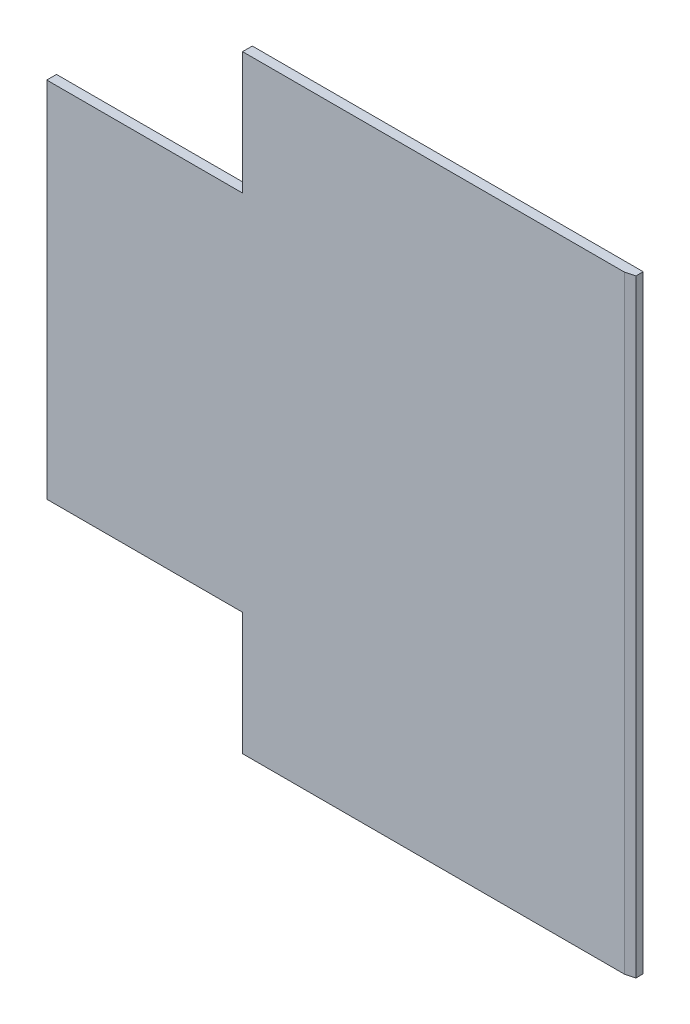
ISO-10303-21;
HEADER;
FILE_DESCRIPTION(('STEP AP214'),'2;1');
FILE_NAME('part.step','',(''),(''),'','','');
FILE_SCHEMA(('AUTOMOTIVE_DESIGN { 1 0 10303 214 1 1 1 1 }'));
ENDSEC;
DATA;
#1=APPLICATION_CONTEXT('core data for automotive mechanical design processes');
#2=APPLICATION_PROTOCOL_DEFINITION('international standard','automotive_design',2000,#1);
#3=PRODUCT_CONTEXT('',#1,'mechanical');
#4=PRODUCT('Part','Part','',(#3));
#5=PRODUCT_RELATED_PRODUCT_CATEGORY('part','',(#4));
#6=PRODUCT_DEFINITION_FORMATION('','',#4);
#7=PRODUCT_DEFINITION_CONTEXT('part definition',#1,'design');
#8=PRODUCT_DEFINITION('design','',#6,#7);
#9=PRODUCT_DEFINITION_SHAPE('','',#8);
#10=(LENGTH_UNIT() NAMED_UNIT(*) SI_UNIT(.MILLI.,.METRE.));
#11=(NAMED_UNIT(*) PLANE_ANGLE_UNIT() SI_UNIT($,.RADIAN.));
#12=(NAMED_UNIT(*) SI_UNIT($,.STERADIAN.) SOLID_ANGLE_UNIT());
#13=UNCERTAINTY_MEASURE_WITH_UNIT(LENGTH_MEASURE(1.E-05),#10,'distance_accuracy_value','');
#14=(GEOMETRIC_REPRESENTATION_CONTEXT(3) GLOBAL_UNCERTAINTY_ASSIGNED_CONTEXT((#13)) GLOBAL_UNIT_ASSIGNED_CONTEXT((#10,
#11,#12)) REPRESENTATION_CONTEXT('',''));
#15=CARTESIAN_POINT('',(0.,0.,0.));
#16=DIRECTION('',(0.,0.,1.));
#17=DIRECTION('',(1.,0.,0.));
#18=AXIS2_PLACEMENT_3D('',#15,#16,#17);
#19=CARTESIAN_POINT('',(0.,198.,0.));
#20=DIRECTION('',(0.,0.,-1.));
#21=DIRECTION('',(-1.,0.,0.));
#22=AXIS2_PLACEMENT_3D('',#19,#20,#21);
#23=PLANE('',#22);
#24=DIRECTION('',(0.,1.,0.));
#25=VECTOR('',#24,1.);
#26=CARTESIAN_POINT('',(124.301364543553,-2.,0.));
#27=LINE('',#26,#25);
#28=CARTESIAN_POINT('',(124.301364543553,0.,0.));
#29=VERTEX_POINT('',#28);
#30=CARTESIAN_POINT('',(124.301364543553,198.,0.));
#31=VERTEX_POINT('',#30);
#32=EDGE_CURVE('E108',#29,#31,#27,.T.);
#33=ORIENTED_EDGE('',*,*,#32,.T.);
#34=DIRECTION('',(1.,0.,0.));
#35=VECTOR('',#34,1.);
#36=CARTESIAN_POINT('',(0.,198.,0.));
#37=LINE('',#36,#35);
#38=CARTESIAN_POINT('',(0.,198.,0.));
#39=VERTEX_POINT('',#38);
#40=EDGE_CURVE('E117',#39,#31,#37,.T.);
#41=ORIENTED_EDGE('',*,*,#40,.F.);
#42=DIRECTION('',(0.,-1.,0.));
#43=VECTOR('',#42,1.);
#44=CARTESIAN_POINT('',(0.,198.,0.));
#45=LINE('',#44,#43);
#46=CARTESIAN_POINT('',(0.,158.11,0.));
#47=VERTEX_POINT('',#46);
#48=EDGE_CURVE('E45',#39,#47,#45,.T.);
#49=ORIENTED_EDGE('',*,*,#48,.T.);
#50=DIRECTION('',(1.,0.,0.));
#51=VECTOR('',#50,1.);
#52=CARTESIAN_POINT('',(-63.76,158.11,0.));
#53=LINE('',#52,#51);
#54=CARTESIAN_POINT('',(-63.76,158.11,0.));
#55=VERTEX_POINT('',#54);
#56=EDGE_CURVE('E185',#55,#47,#53,.T.);
#57=ORIENTED_EDGE('',*,*,#56,.F.);
#58=DIRECTION('',(0.,1.,0.));
#59=VECTOR('',#58,1.);
#60=CARTESIAN_POINT('',(-63.76,39.89,0.));
#61=LINE('',#60,#59);
#62=CARTESIAN_POINT('',(-63.76,39.89,0.));
#63=VERTEX_POINT('',#62);
#64=EDGE_CURVE('E176',#63,#55,#61,.T.);
#65=ORIENTED_EDGE('',*,*,#64,.F.);
#66=DIRECTION('',(1.,0.,0.));
#67=VECTOR('',#66,1.);
#68=CARTESIAN_POINT('',(-63.76,39.89,0.));
#69=LINE('',#68,#67);
#70=CARTESIAN_POINT('',(0.,39.89,0.));
#71=VERTEX_POINT('',#70);
#72=EDGE_CURVE('E148',#63,#71,#69,.T.);
#73=ORIENTED_EDGE('',*,*,#72,.T.);
#74=CARTESIAN_POINT('',(0.,0.,0.));
#75=VERTEX_POINT('',#74);
#76=EDGE_CURVE('E142',#71,#75,#45,.T.);
#77=ORIENTED_EDGE('',*,*,#76,.T.);
#78=DIRECTION('',(1.,0.,0.));
#79=VECTOR('',#78,1.);
#80=CARTESIAN_POINT('',(0.,0.,0.));
#81=LINE('',#80,#79);
#82=EDGE_CURVE('E120',#75,#29,#81,.T.);
#83=ORIENTED_EDGE('',*,*,#82,.T.);
#84=EDGE_LOOP('',(#33,#41,#49,#57,#65,#73,#77,#83));
#85=FACE_BOUND('',#84,.T.);
#86=ADVANCED_FACE('F37',(#85),#23,.F.);
#87=CARTESIAN_POINT('',(0.,198.,0.));
#88=DIRECTION('',(0.,1.,0.));
#89=DIRECTION('',(0.,0.,1.));
#90=AXIS2_PLACEMENT_3D('',#87,#88,#89);
#91=PLANE('',#90);
#92=ORIENTED_EDGE('',*,*,#40,.T.);
#93=DIRECTION('',(0.966079041831666,0.,-0.258246558415809));
#94=VECTOR('',#93,1.);
#95=CARTESIAN_POINT('',(124.301364543553,198.,0.));
#96=LINE('',#95,#94);
#97=CARTESIAN_POINT('',(127.31,198.,-0.804250706735322));
#98=VERTEX_POINT('',#97);
#99=EDGE_CURVE('E105',#31,#98,#96,.T.);
#100=ORIENTED_EDGE('',*,*,#99,.T.);
#101=DIRECTION('',(0.,0.,1.));
#102=VECTOR('',#101,1.);
#103=CARTESIAN_POINT('',(127.31,198.,-3.17));
#104=LINE('',#103,#102);
#105=CARTESIAN_POINT('',(127.31,198.,-3.17));
#106=VERTEX_POINT('',#105);
#107=EDGE_CURVE('E164',#106,#98,#104,.T.);
#108=ORIENTED_EDGE('',*,*,#107,.F.);
#109=DIRECTION('',(-1.,0.,0.));
#110=VECTOR('',#109,1.);
#111=CARTESIAN_POINT('',(79.31,198.,-3.17));
#112=LINE('',#111,#110);
#113=CARTESIAN_POINT('',(0.,198.,-3.17));
#114=VERTEX_POINT('',#113);
#115=EDGE_CURVE('E126',#106,#114,#112,.T.);
#116=ORIENTED_EDGE('',*,*,#115,.T.);
#117=DIRECTION('',(0.,0.,1.));
#118=VECTOR('',#117,1.);
#119=CARTESIAN_POINT('',(0.,198.,-3.17));
#120=LINE('',#119,#118);
#121=EDGE_CURVE('E124',#114,#39,#120,.T.);
#122=ORIENTED_EDGE('',*,*,#121,.T.);
#123=EDGE_LOOP('',(#92,#100,#108,#116,#122));
#124=FACE_BOUND('',#123,.T.);
#125=ADVANCED_FACE('F122',(#124),#91,.T.);
#126=CARTESIAN_POINT('',(0.,0.,0.));
#127=DIRECTION('',(0.,1.,0.));
#128=DIRECTION('',(0.,0.,1.));
#129=AXIS2_PLACEMENT_3D('',#126,#127,#128);
#130=PLANE('',#129);
#131=DIRECTION('',(0.966079041831666,0.,-0.258246558415809));
#132=VECTOR('',#131,1.);
#133=CARTESIAN_POINT('',(8.28981772041058,0.,31.011523287751));
#134=LINE('',#133,#132);
#135=CARTESIAN_POINT('',(127.31,0.,-0.804250706735322));
#136=VERTEX_POINT('',#135);
#137=EDGE_CURVE('E52',#29,#136,#134,.T.);
#138=ORIENTED_EDGE('',*,*,#137,.F.);
#139=ORIENTED_EDGE('',*,*,#82,.F.);
#140=DIRECTION('',(0.,0.,1.));
#141=VECTOR('',#140,1.);
#142=CARTESIAN_POINT('',(0.,0.,-3.17));
#143=LINE('',#142,#141);
#144=CARTESIAN_POINT('',(0.,0.,-3.17));
#145=VERTEX_POINT('',#144);
#146=EDGE_CURVE('E134',#145,#75,#143,.T.);
#147=ORIENTED_EDGE('',*,*,#146,.F.);
#148=DIRECTION('',(-1.,0.,0.));
#149=VECTOR('',#148,1.);
#150=CARTESIAN_POINT('',(79.31,0.,-3.17));
#151=LINE('',#150,#149);
#152=CARTESIAN_POINT('',(127.31,0.,-3.17));
#153=VERTEX_POINT('',#152);
#154=EDGE_CURVE('E130',#153,#145,#151,.T.);
#155=ORIENTED_EDGE('',*,*,#154,.F.);
#156=DIRECTION('',(0.,0.,-1.));
#157=VECTOR('',#156,1.);
#158=CARTESIAN_POINT('',(127.31,0.,-3.17));
#159=LINE('',#158,#157);
#160=EDGE_CURVE('E162',#136,#153,#159,.T.);
#161=ORIENTED_EDGE('',*,*,#160,.F.);
#162=EDGE_LOOP('',(#138,#139,#147,#155,#161));
#163=FACE_BOUND('',#162,.T.);
#164=ADVANCED_FACE('F151',(#163),#130,.F.);
#165=CARTESIAN_POINT('',(127.31,0.,0.));
#166=DIRECTION('',(1.,0.,0.));
#167=DIRECTION('',(0.,0.,-1.));
#168=AXIS2_PLACEMENT_3D('',#165,#166,#167);
#169=PLANE('',#168);
#170=ORIENTED_EDGE('',*,*,#107,.T.);
#171=DIRECTION('',(0.,-1.,0.));
#172=VECTOR('',#171,1.);
#173=CARTESIAN_POINT('',(127.31,0.,-0.804250706735322));
#174=LINE('',#173,#172);
#175=EDGE_CURVE('E11',#98,#136,#174,.T.);
#176=ORIENTED_EDGE('',*,*,#175,.T.);
#177=ORIENTED_EDGE('',*,*,#160,.T.);
#178=DIRECTION('',(0.,1.,0.));
#179=VECTOR('',#178,1.);
#180=CARTESIAN_POINT('',(127.31,0.,-3.17));
#181=LINE('',#180,#179);
#182=EDGE_CURVE('E161',#153,#106,#181,.T.);
#183=ORIENTED_EDGE('',*,*,#182,.T.);
#184=EDGE_LOOP('',(#170,#176,#177,#183));
#185=FACE_BOUND('',#184,.T.);
#186=ADVANCED_FACE('F198',(#185),#169,.T.);
#187=CARTESIAN_POINT('',(0.,198.,-3.17));
#188=DIRECTION('',(1.,0.,0.));
#189=DIRECTION('',(0.,0.,-1.));
#190=AXIS2_PLACEMENT_3D('',#187,#188,#189);
#191=PLANE('',#190);
#192=DIRECTION('',(0.,0.,-1.));
#193=VECTOR('',#192,1.);
#194=CARTESIAN_POINT('',(0.,158.11,0.));
#195=LINE('',#194,#193);
#196=CARTESIAN_POINT('',(0.,158.11,-3.17));
#197=VERTEX_POINT('',#196);
#198=EDGE_CURVE('E166',#47,#197,#195,.T.);
#199=ORIENTED_EDGE('',*,*,#198,.F.);
#200=ORIENTED_EDGE('',*,*,#48,.F.);
#201=ORIENTED_EDGE('',*,*,#121,.F.);
#202=DIRECTION('',(0.,-1.,0.));
#203=VECTOR('',#202,1.);
#204=CARTESIAN_POINT('',(0.,198.,-3.17));
#205=LINE('',#204,#203);
#206=EDGE_CURVE('E141',#114,#197,#205,.T.);
#207=ORIENTED_EDGE('',*,*,#206,.T.);
#208=EDGE_LOOP('',(#199,#200,#201,#207));
#209=FACE_BOUND('',#208,.T.);
#210=ADVANCED_FACE('F39',(#209),#191,.F.);
#211=DIRECTION('',(0.,0.,1.));
#212=VECTOR('',#211,1.);
#213=CARTESIAN_POINT('',(0.,39.89,0.));
#214=LINE('',#213,#212);
#215=CARTESIAN_POINT('',(0.,39.89,-3.17));
#216=VERTEX_POINT('',#215);
#217=EDGE_CURVE('E59',#216,#71,#214,.T.);
#218=ORIENTED_EDGE('',*,*,#217,.F.);
#219=EDGE_CURVE('E128',#216,#145,#205,.T.);
#220=ORIENTED_EDGE('',*,*,#219,.T.);
#221=ORIENTED_EDGE('',*,*,#146,.T.);
#222=ORIENTED_EDGE('',*,*,#76,.F.);
#223=EDGE_LOOP('',(#218,#220,#221,#222));
#224=FACE_BOUND('',#223,.T.);
#225=ADVANCED_FACE('F154',(#224),#191,.F.);
#226=CARTESIAN_POINT('',(79.31,198.,-3.17));
#227=DIRECTION('',(0.,0.,1.));
#228=DIRECTION('',(1.,0.,0.));
#229=AXIS2_PLACEMENT_3D('',#226,#227,#228);
#230=PLANE('',#229);
#231=ORIENTED_EDGE('',*,*,#154,.T.);
#232=ORIENTED_EDGE('',*,*,#219,.F.);
#233=DIRECTION('',(1.,0.,0.));
#234=VECTOR('',#233,1.);
#235=CARTESIAN_POINT('',(-63.76,39.89,-3.17));
#236=LINE('',#235,#234);
#237=CARTESIAN_POINT('',(-63.76,39.89,-3.17));
#238=VERTEX_POINT('',#237);
#239=EDGE_CURVE('E137',#238,#216,#236,.T.);
#240=ORIENTED_EDGE('',*,*,#239,.F.);
#241=DIRECTION('',(0.,-1.,0.));
#242=VECTOR('',#241,1.);
#243=CARTESIAN_POINT('',(-63.76,39.89,-3.17));
#244=LINE('',#243,#242);
#245=CARTESIAN_POINT('',(-63.76,158.11,-3.17));
#246=VERTEX_POINT('',#245);
#247=EDGE_CURVE('E171',#246,#238,#244,.T.);
#248=ORIENTED_EDGE('',*,*,#247,.F.);
#249=DIRECTION('',(1.,0.,0.));
#250=VECTOR('',#249,1.);
#251=CARTESIAN_POINT('',(-63.76,158.11,-3.17));
#252=LINE('',#251,#250);
#253=EDGE_CURVE('E179',#246,#197,#252,.T.);
#254=ORIENTED_EDGE('',*,*,#253,.T.);
#255=ORIENTED_EDGE('',*,*,#206,.F.);
#256=ORIENTED_EDGE('',*,*,#115,.F.);
#257=ORIENTED_EDGE('',*,*,#182,.F.);
#258=EDGE_LOOP('',(#231,#232,#240,#248,#254,#255,#256,#257));
#259=FACE_BOUND('',#258,.T.);
#260=ADVANCED_FACE('F159',(#259),#230,.F.);
#261=CARTESIAN_POINT('',(-63.76,39.89,0.));
#262=DIRECTION('',(0.,1.,0.));
#263=DIRECTION('',(0.,0.,1.));
#264=AXIS2_PLACEMENT_3D('',#261,#262,#263);
#265=PLANE('',#264);
#266=ORIENTED_EDGE('',*,*,#217,.T.);
#267=ORIENTED_EDGE('',*,*,#72,.F.);
#268=DIRECTION('',(0.,0.,1.));
#269=VECTOR('',#268,1.);
#270=CARTESIAN_POINT('',(-63.76,39.89,0.));
#271=LINE('',#270,#269);
#272=EDGE_CURVE('E174',#238,#63,#271,.T.);
#273=ORIENTED_EDGE('',*,*,#272,.F.);
#274=ORIENTED_EDGE('',*,*,#239,.T.);
#275=EDGE_LOOP('',(#266,#267,#273,#274));
#276=FACE_BOUND('',#275,.T.);
#277=ADVANCED_FACE('F188',(#276),#265,.F.);
#278=CARTESIAN_POINT('',(-63.76,158.11,0.));
#279=DIRECTION('',(0.,-1.,0.));
#280=DIRECTION('',(0.,0.,-1.));
#281=AXIS2_PLACEMENT_3D('',#278,#279,#280);
#282=PLANE('',#281);
#283=ORIENTED_EDGE('',*,*,#198,.T.);
#284=ORIENTED_EDGE('',*,*,#253,.F.);
#285=DIRECTION('',(0.,0.,-1.));
#286=VECTOR('',#285,1.);
#287=CARTESIAN_POINT('',(-63.76,158.11,0.));
#288=LINE('',#287,#286);
#289=EDGE_CURVE('E178',#55,#246,#288,.T.);
#290=ORIENTED_EDGE('',*,*,#289,.F.);
#291=ORIENTED_EDGE('',*,*,#56,.T.);
#292=EDGE_LOOP('',(#283,#284,#290,#291));
#293=FACE_BOUND('',#292,.T.);
#294=ADVANCED_FACE('F196',(#293),#282,.F.);
#295=CARTESIAN_POINT('',(-63.76,0.,0.));
#296=DIRECTION('',(-1.,0.,0.));
#297=DIRECTION('',(0.,0.,1.));
#298=AXIS2_PLACEMENT_3D('',#295,#296,#297);
#299=PLANE('',#298);
#300=ORIENTED_EDGE('',*,*,#247,.T.);
#301=ORIENTED_EDGE('',*,*,#272,.T.);
#302=ORIENTED_EDGE('',*,*,#64,.T.);
#303=ORIENTED_EDGE('',*,*,#289,.T.);
#304=EDGE_LOOP('',(#300,#301,#302,#303));
#305=FACE_BOUND('',#304,.T.);
#306=ADVANCED_FACE('F193',(#305),#299,.T.);
#307=CARTESIAN_POINT('',(124.301364543553,-2.,0.));
#308=DIRECTION('',(0.258246558415809,0.,0.966079041831666));
#309=DIRECTION('',(0.966079041831666,0.,-0.258246558415809));
#310=AXIS2_PLACEMENT_3D('',#307,#308,#309);
#311=PLANE('',#310);
#312=ORIENTED_EDGE('',*,*,#137,.T.);
#313=ORIENTED_EDGE('',*,*,#175,.F.);
#314=ORIENTED_EDGE('',*,*,#99,.F.);
#315=ORIENTED_EDGE('',*,*,#32,.F.);
#316=EDGE_LOOP('',(#312,#313,#314,#315));
#317=FACE_BOUND('',#316,.T.);
#318=ADVANCED_FACE('F107',(#317),#311,.T.);
#319=CLOSED_SHELL('',(#86,#125,#164,#186,#210,#225,#260,#277,#294,#306,#318));
#320=MANIFOLD_SOLID_BREP('B2',#319);
#321=ADVANCED_BREP_SHAPE_REPRESENTATION('',(#18,#320),#14);
#322=SHAPE_DEFINITION_REPRESENTATION(#9,#321);
ENDSEC;
END-ISO-10303-21;
